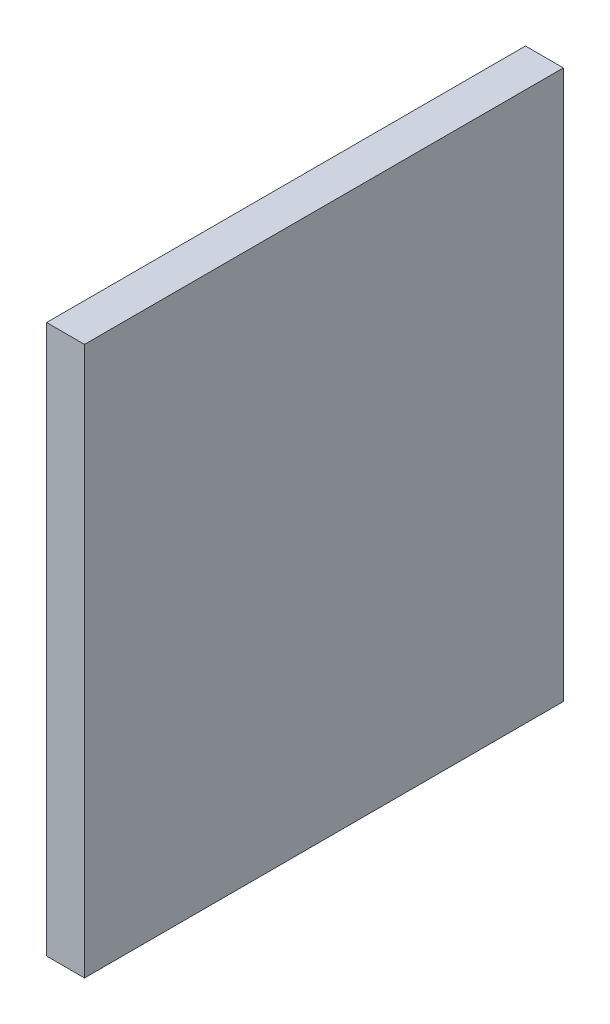
ISO-10303-21;
HEADER;
FILE_DESCRIPTION(('STEP AP214'),'2;1');
FILE_NAME('part.step','',(''),(''),'','','');
FILE_SCHEMA(('AUTOMOTIVE_DESIGN { 1 0 10303 214 1 1 1 1 }'));
ENDSEC;
DATA;
#1=APPLICATION_CONTEXT('core data for automotive mechanical design processes');
#2=APPLICATION_PROTOCOL_DEFINITION('international standard','automotive_design',2000,#1);
#3=PRODUCT_CONTEXT('',#1,'mechanical');
#4=PRODUCT('Part','Part','',(#3));
#5=PRODUCT_RELATED_PRODUCT_CATEGORY('part','',(#4));
#6=PRODUCT_DEFINITION_FORMATION('','',#4);
#7=PRODUCT_DEFINITION_CONTEXT('part definition',#1,'design');
#8=PRODUCT_DEFINITION('design','',#6,#7);
#9=PRODUCT_DEFINITION_SHAPE('','',#8);
#10=(LENGTH_UNIT() NAMED_UNIT(*) SI_UNIT(.MILLI.,.METRE.));
#11=(NAMED_UNIT(*) PLANE_ANGLE_UNIT() SI_UNIT($,.RADIAN.));
#12=(NAMED_UNIT(*) SI_UNIT($,.STERADIAN.) SOLID_ANGLE_UNIT());
#13=UNCERTAINTY_MEASURE_WITH_UNIT(LENGTH_MEASURE(1.E-05),#10,'distance_accuracy_value','');
#14=(GEOMETRIC_REPRESENTATION_CONTEXT(3) GLOBAL_UNCERTAINTY_ASSIGNED_CONTEXT((#13)) GLOBAL_UNIT_ASSIGNED_CONTEXT((#10,
#11,#12)) REPRESENTATION_CONTEXT('',''));
#15=CARTESIAN_POINT('',(0.,0.,0.));
#16=DIRECTION('',(0.,0.,1.));
#17=DIRECTION('',(1.,0.,0.));
#18=AXIS2_PLACEMENT_3D('',#15,#16,#17);
#19=CARTESIAN_POINT('',(3.8,-36.6464357998769,56.4347826086956));
#20=DIRECTION('',(0.,1.,0.));
#21=DIRECTION('',(0.,0.,1.));
#22=AXIS2_PLACEMENT_3D('',#19,#20,#21);
#23=PLANE('',#22);
#24=DIRECTION('',(0.,0.,-1.));
#25=VECTOR('',#24,1.);
#26=CARTESIAN_POINT('',(0.,-36.6464357998769,56.4347826086956));
#27=LINE('',#26,#25);
#28=CARTESIAN_POINT('',(0.,-36.6464357998769,56.4347826086956));
#29=VERTEX_POINT('',#28);
#30=CARTESIAN_POINT('',(0.,-36.6464357998769,8.43478260869565));
#31=VERTEX_POINT('',#30);
#32=EDGE_CURVE('E97',#29,#31,#27,.T.);
#33=ORIENTED_EDGE('',*,*,#32,.T.);
#34=DIRECTION('',(-1.,0.,0.));
#35=VECTOR('',#34,1.);
#36=CARTESIAN_POINT('',(3.8,-36.6464357998769,8.43478260869565));
#37=LINE('',#36,#35);
#38=CARTESIAN_POINT('',(3.8,-36.6464357998769,8.43478260869565));
#39=VERTEX_POINT('',#38);
#40=EDGE_CURVE('E11',#39,#31,#37,.T.);
#41=ORIENTED_EDGE('',*,*,#40,.F.);
#42=DIRECTION('',(0.,0.,-1.));
#43=VECTOR('',#42,1.);
#44=CARTESIAN_POINT('',(3.8,-36.6464357998769,56.4347826086956));
#45=LINE('',#44,#43);
#46=CARTESIAN_POINT('',(3.8,-36.6464357998769,56.4347826086956));
#47=VERTEX_POINT('',#46);
#48=EDGE_CURVE('E74',#47,#39,#45,.T.);
#49=ORIENTED_EDGE('',*,*,#48,.F.);
#50=DIRECTION('',(-1.,0.,0.));
#51=VECTOR('',#50,1.);
#52=CARTESIAN_POINT('',(3.8,-36.6464357998769,56.4347826086956));
#53=LINE('',#52,#51);
#54=EDGE_CURVE('E93',#47,#29,#53,.T.);
#55=ORIENTED_EDGE('',*,*,#54,.T.);
#56=EDGE_LOOP('',(#33,#41,#49,#55));
#57=FACE_BOUND('',#56,.T.);
#58=ADVANCED_FACE('F35',(#57),#23,.F.);
#59=CARTESIAN_POINT('',(3.8,18.3535642001231,8.43478260869565));
#60=DIRECTION('',(0.,0.,-1.));
#61=DIRECTION('',(-1.,0.,0.));
#62=AXIS2_PLACEMENT_3D('',#59,#60,#61);
#63=PLANE('',#62);
#64=DIRECTION('',(0.,-1.,0.));
#65=VECTOR('',#64,1.);
#66=CARTESIAN_POINT('',(0.,18.3535642001231,8.43478260869565));
#67=LINE('',#66,#65);
#68=CARTESIAN_POINT('',(0.,18.3535642001231,8.43478260869565));
#69=VERTEX_POINT('',#68);
#70=EDGE_CURVE('E83',#69,#31,#67,.T.);
#71=ORIENTED_EDGE('',*,*,#70,.F.);
#72=DIRECTION('',(-1.,0.,0.));
#73=VECTOR('',#72,1.);
#74=CARTESIAN_POINT('',(3.8,18.3535642001231,8.43478260869565));
#75=LINE('',#74,#73);
#76=CARTESIAN_POINT('',(3.8,18.3535642001231,8.43478260869565));
#77=VERTEX_POINT('',#76);
#78=EDGE_CURVE('E43',#77,#69,#75,.T.);
#79=ORIENTED_EDGE('',*,*,#78,.F.);
#80=DIRECTION('',(0.,-1.,0.));
#81=VECTOR('',#80,1.);
#82=CARTESIAN_POINT('',(3.8,18.3535642001231,8.43478260869565));
#83=LINE('',#82,#81);
#84=EDGE_CURVE('E81',#77,#39,#83,.T.);
#85=ORIENTED_EDGE('',*,*,#84,.T.);
#86=ORIENTED_EDGE('',*,*,#40,.T.);
#87=EDGE_LOOP('',(#71,#79,#85,#86));
#88=FACE_BOUND('',#87,.T.);
#89=ADVANCED_FACE('F80',(#88),#63,.T.);
#90=CARTESIAN_POINT('',(3.8,18.3535642001231,56.4347826086956));
#91=DIRECTION('',(0.,1.,0.));
#92=DIRECTION('',(0.,0.,1.));
#93=AXIS2_PLACEMENT_3D('',#90,#91,#92);
#94=PLANE('',#93);
#95=DIRECTION('',(0.,0.,-1.));
#96=VECTOR('',#95,1.);
#97=CARTESIAN_POINT('',(0.,18.3535642001231,56.4347826086956));
#98=LINE('',#97,#96);
#99=CARTESIAN_POINT('',(0.,18.3535642001231,56.4347826086956));
#100=VERTEX_POINT('',#99);
#101=EDGE_CURVE('E101',#100,#69,#98,.T.);
#102=ORIENTED_EDGE('',*,*,#101,.F.);
#103=DIRECTION('',(-1.,0.,0.));
#104=VECTOR('',#103,1.);
#105=CARTESIAN_POINT('',(3.8,18.3535642001231,56.4347826086956));
#106=LINE('',#105,#104);
#107=CARTESIAN_POINT('',(3.8,18.3535642001231,56.4347826086956));
#108=VERTEX_POINT('',#107);
#109=EDGE_CURVE('E66',#108,#100,#106,.T.);
#110=ORIENTED_EDGE('',*,*,#109,.F.);
#111=DIRECTION('',(0.,0.,-1.));
#112=VECTOR('',#111,1.);
#113=CARTESIAN_POINT('',(3.8,18.3535642001231,56.4347826086956));
#114=LINE('',#113,#112);
#115=EDGE_CURVE('E89',#108,#77,#114,.T.);
#116=ORIENTED_EDGE('',*,*,#115,.T.);
#117=ORIENTED_EDGE('',*,*,#78,.T.);
#118=EDGE_LOOP('',(#102,#110,#116,#117));
#119=FACE_BOUND('',#118,.T.);
#120=ADVANCED_FACE('F91',(#119),#94,.T.);
#121=CARTESIAN_POINT('',(3.8,18.3535642001231,56.4347826086956));
#122=DIRECTION('',(0.,0.,-1.));
#123=DIRECTION('',(-1.,0.,0.));
#124=AXIS2_PLACEMENT_3D('',#121,#122,#123);
#125=PLANE('',#124);
#126=DIRECTION('',(0.,-1.,0.));
#127=VECTOR('',#126,1.);
#128=CARTESIAN_POINT('',(0.,18.3535642001231,56.4347826086956));
#129=LINE('',#128,#127);
#130=EDGE_CURVE('E69',#100,#29,#129,.T.);
#131=ORIENTED_EDGE('',*,*,#130,.T.);
#132=ORIENTED_EDGE('',*,*,#54,.F.);
#133=DIRECTION('',(0.,-1.,0.));
#134=VECTOR('',#133,1.);
#135=CARTESIAN_POINT('',(3.8,18.3535642001231,56.4347826086956));
#136=LINE('',#135,#134);
#137=EDGE_CURVE('E51',#108,#47,#136,.T.);
#138=ORIENTED_EDGE('',*,*,#137,.F.);
#139=ORIENTED_EDGE('',*,*,#109,.T.);
#140=EDGE_LOOP('',(#131,#132,#138,#139));
#141=FACE_BOUND('',#140,.T.);
#142=ADVANCED_FACE('F114',(#141),#125,.F.);
#143=CARTESIAN_POINT('',(3.8,0.,0.));
#144=DIRECTION('',(-1.,0.,0.));
#145=DIRECTION('',(0.,0.,1.));
#146=AXIS2_PLACEMENT_3D('',#143,#144,#145);
#147=PLANE('',#146);
#148=ORIENTED_EDGE('',*,*,#48,.T.);
#149=ORIENTED_EDGE('',*,*,#84,.F.);
#150=ORIENTED_EDGE('',*,*,#115,.F.);
#151=ORIENTED_EDGE('',*,*,#137,.T.);
#152=EDGE_LOOP('',(#148,#149,#150,#151));
#153=FACE_BOUND('',#152,.T.);
#154=ADVANCED_FACE('F88',(#153),#147,.F.);
#155=CARTESIAN_POINT('',(0.,0.,0.));
#156=DIRECTION('',(-1.,0.,0.));
#157=DIRECTION('',(0.,0.,1.));
#158=AXIS2_PLACEMENT_3D('',#155,#156,#157);
#159=PLANE('',#158);
#160=ORIENTED_EDGE('',*,*,#32,.F.);
#161=ORIENTED_EDGE('',*,*,#130,.F.);
#162=ORIENTED_EDGE('',*,*,#101,.T.);
#163=ORIENTED_EDGE('',*,*,#70,.T.);
#164=EDGE_LOOP('',(#160,#161,#162,#163));
#165=FACE_BOUND('',#164,.T.);
#166=ADVANCED_FACE('F108',(#165),#159,.T.);
#167=CLOSED_SHELL('',(#58,#89,#120,#142,#154,#166));
#168=MANIFOLD_SOLID_BREP('B2',#167);
#169=ADVANCED_BREP_SHAPE_REPRESENTATION('',(#18,#168),#14);
#170=SHAPE_DEFINITION_REPRESENTATION(#9,#169);
ENDSEC;
END-ISO-10303-21;
